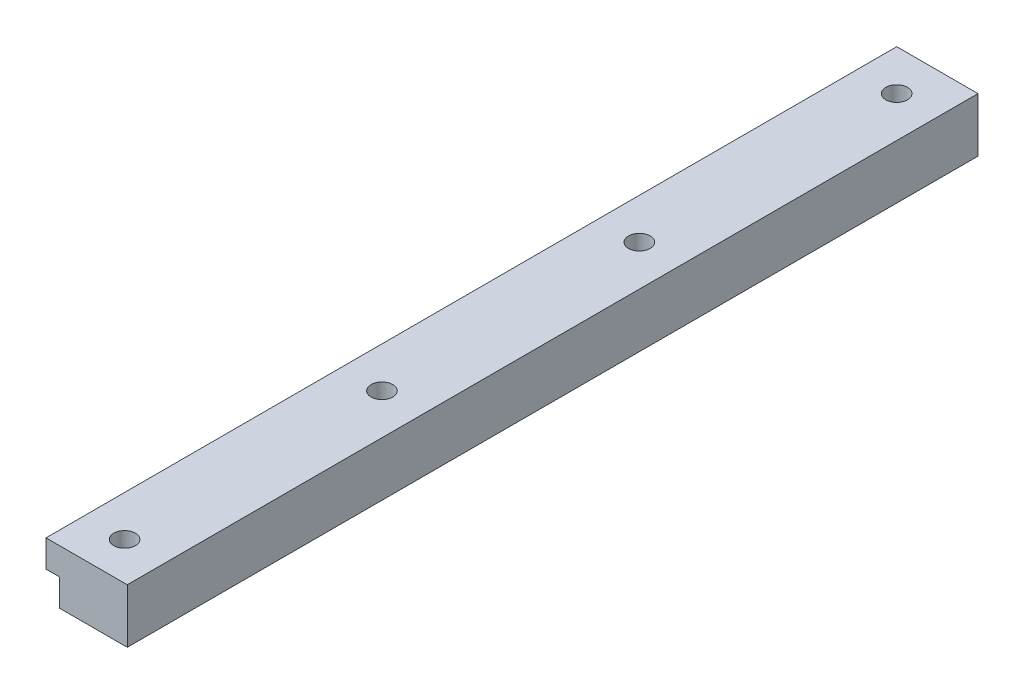
ISO-10303-21;
HEADER;
FILE_DESCRIPTION(('STEP AP214'),'2;1');
FILE_NAME('part.step','',(''),(''),'','','');
FILE_SCHEMA(('AUTOMOTIVE_DESIGN { 1 0 10303 214 1 1 1 1 }'));
ENDSEC;
DATA;
#1=APPLICATION_CONTEXT('core data for automotive mechanical design processes');
#2=APPLICATION_PROTOCOL_DEFINITION('international standard','automotive_design',2000,#1);
#3=PRODUCT_CONTEXT('',#1,'mechanical');
#4=PRODUCT('Part','Part','',(#3));
#5=PRODUCT_RELATED_PRODUCT_CATEGORY('part','',(#4));
#6=PRODUCT_DEFINITION_FORMATION('','',#4);
#7=PRODUCT_DEFINITION_CONTEXT('part definition',#1,'design');
#8=PRODUCT_DEFINITION('design','',#6,#7);
#9=PRODUCT_DEFINITION_SHAPE('','',#8);
#10=(LENGTH_UNIT() NAMED_UNIT(*) SI_UNIT(.MILLI.,.METRE.));
#11=(NAMED_UNIT(*) PLANE_ANGLE_UNIT() SI_UNIT($,.RADIAN.));
#12=(NAMED_UNIT(*) SI_UNIT($,.STERADIAN.) SOLID_ANGLE_UNIT());
#13=UNCERTAINTY_MEASURE_WITH_UNIT(LENGTH_MEASURE(1.E-05),#10,'distance_accuracy_value','');
#14=(GEOMETRIC_REPRESENTATION_CONTEXT(3) GLOBAL_UNCERTAINTY_ASSIGNED_CONTEXT((#13)) GLOBAL_UNIT_ASSIGNED_CONTEXT((#10,
#11,#12)) REPRESENTATION_CONTEXT('',''));
#15=CARTESIAN_POINT('',(0.,0.,0.));
#16=DIRECTION('',(0.,0.,1.));
#17=DIRECTION('',(1.,0.,0.));
#18=AXIS2_PLACEMENT_3D('',#15,#16,#17);
#19=CARTESIAN_POINT('',(-25.,0.,314.));
#20=DIRECTION('',(0.,1.,0.));
#21=DIRECTION('',(0.,0.,1.));
#22=AXIS2_PLACEMENT_3D('',#19,#20,#21);
#23=PLANE('',#22);
#24=CARTESIAN_POINT('',(-15.,0.,300.));
#25=DIRECTION('',(0.,1.,0.));
#26=DIRECTION('',(0.,0.,1.));
#27=AXIS2_PLACEMENT_3D('',#24,#25,#26);
#28=CIRCLE('',#27,4.);
#29=CARTESIAN_POINT('',(-15.,0.,304.));
#30=VERTEX_POINT('',#29);
#31=EDGE_CURVE('E149',#30,#30,#28,.T.);
#32=ORIENTED_EDGE('',*,*,#31,.T.);
#33=EDGE_LOOP('',(#32));
#34=FACE_BOUND('',#33,.T.);
#35=CARTESIAN_POINT('',(-15.,0.,205.));
#36=DIRECTION('',(0.,1.,0.));
#37=DIRECTION('',(0.,0.,1.));
#38=AXIS2_PLACEMENT_3D('',#35,#36,#37);
#39=CIRCLE('',#38,4.);
#40=CARTESIAN_POINT('',(-15.,0.,209.));
#41=VERTEX_POINT('',#40);
#42=EDGE_CURVE('E153',#41,#41,#39,.T.);
#43=ORIENTED_EDGE('',*,*,#42,.T.);
#44=EDGE_LOOP('',(#43));
#45=FACE_BOUND('',#44,.T.);
#46=CARTESIAN_POINT('',(-15.,0.,110.));
#47=DIRECTION('',(0.,1.,0.));
#48=DIRECTION('',(0.,0.,1.));
#49=AXIS2_PLACEMENT_3D('',#46,#47,#48);
#50=CIRCLE('',#49,4.);
#51=CARTESIAN_POINT('',(-15.,0.,114.));
#52=VERTEX_POINT('',#51);
#53=EDGE_CURVE('E157',#52,#52,#50,.T.);
#54=ORIENTED_EDGE('',*,*,#53,.T.);
#55=EDGE_LOOP('',(#54));
#56=FACE_BOUND('',#55,.T.);
#57=CARTESIAN_POINT('',(-15.,0.,15.));
#58=DIRECTION('',(0.,1.,0.));
#59=DIRECTION('',(0.,0.,1.));
#60=AXIS2_PLACEMENT_3D('',#57,#58,#59);
#61=CIRCLE('',#60,4.);
#62=CARTESIAN_POINT('',(-15.,0.,19.));
#63=VERTEX_POINT('',#62);
#64=EDGE_CURVE('E86',#63,#63,#61,.T.);
#65=ORIENTED_EDGE('',*,*,#64,.T.);
#66=EDGE_LOOP('',(#65));
#67=FACE_BOUND('',#66,.T.);
#68=DIRECTION('',(1.,0.,0.));
#69=VECTOR('',#68,1.);
#70=CARTESIAN_POINT('',(-25.,0.,0.));
#71=LINE('',#70,#69);
#72=CARTESIAN_POINT('',(-25.,0.,0.));
#73=VERTEX_POINT('',#72);
#74=CARTESIAN_POINT('',(0.,0.,0.));
#75=VERTEX_POINT('',#74);
#76=EDGE_CURVE('E72',#73,#75,#71,.T.);
#77=ORIENTED_EDGE('',*,*,#76,.T.);
#78=DIRECTION('',(0.,0.,-1.));
#79=VECTOR('',#78,1.);
#80=CARTESIAN_POINT('',(0.,0.,314.));
#81=LINE('',#80,#79);
#82=CARTESIAN_POINT('',(0.,0.,314.));
#83=VERTEX_POINT('',#82);
#84=EDGE_CURVE('E11',#83,#75,#81,.T.);
#85=ORIENTED_EDGE('',*,*,#84,.F.);
#86=DIRECTION('',(1.,0.,0.));
#87=VECTOR('',#86,1.);
#88=CARTESIAN_POINT('',(-25.,0.,314.));
#89=LINE('',#88,#87);
#90=CARTESIAN_POINT('',(-25.,0.,314.));
#91=VERTEX_POINT('',#90);
#92=EDGE_CURVE('E100',#91,#83,#89,.T.);
#93=ORIENTED_EDGE('',*,*,#92,.F.);
#94=DIRECTION('',(0.,0.,-1.));
#95=VECTOR('',#94,1.);
#96=CARTESIAN_POINT('',(-25.,0.,314.));
#97=LINE('',#96,#95);
#98=EDGE_CURVE('E85',#91,#73,#97,.T.);
#99=ORIENTED_EDGE('',*,*,#98,.T.);
#100=EDGE_LOOP('',(#77,#85,#93,#99));
#101=FACE_BOUND('',#100,.T.);
#102=ADVANCED_FACE('F16',(#34,#45,#56,#67,#101),#23,.F.);
#103=CARTESIAN_POINT('',(0.,0.,314.));
#104=DIRECTION('',(-1.,0.,0.));
#105=DIRECTION('',(0.,0.,1.));
#106=AXIS2_PLACEMENT_3D('',#103,#104,#105);
#107=PLANE('',#106);
#108=DIRECTION('',(0.,1.,0.));
#109=VECTOR('',#108,1.);
#110=CARTESIAN_POINT('',(0.,0.,0.));
#111=LINE('',#110,#109);
#112=CARTESIAN_POINT('',(0.,20.,0.));
#113=VERTEX_POINT('',#112);
#114=EDGE_CURVE('E68',#75,#113,#111,.T.);
#115=ORIENTED_EDGE('',*,*,#114,.T.);
#116=DIRECTION('',(0.,0.,-1.));
#117=VECTOR('',#116,1.);
#118=CARTESIAN_POINT('',(0.,20.,314.));
#119=LINE('',#118,#117);
#120=CARTESIAN_POINT('',(0.,20.,314.));
#121=VERTEX_POINT('',#120);
#122=EDGE_CURVE('E23',#121,#113,#119,.T.);
#123=ORIENTED_EDGE('',*,*,#122,.F.);
#124=DIRECTION('',(0.,1.,0.));
#125=VECTOR('',#124,1.);
#126=CARTESIAN_POINT('',(0.,0.,314.));
#127=LINE('',#126,#125);
#128=EDGE_CURVE('E81',#83,#121,#127,.T.);
#129=ORIENTED_EDGE('',*,*,#128,.F.);
#130=ORIENTED_EDGE('',*,*,#84,.T.);
#131=EDGE_LOOP('',(#115,#123,#129,#130));
#132=FACE_BOUND('',#131,.T.);
#133=ADVANCED_FACE('F80',(#132),#107,.F.);
#134=CARTESIAN_POINT('',(0.,20.,314.));
#135=DIRECTION('',(0.,-1.,0.));
#136=DIRECTION('',(1.,0.,0.));
#137=AXIS2_PLACEMENT_3D('',#134,#135,#136);
#138=PLANE('',#137);
#139=CARTESIAN_POINT('',(-15.,20.,300.));
#140=DIRECTION('',(0.,1.,0.));
#141=DIRECTION('',(0.,0.,1.));
#142=AXIS2_PLACEMENT_3D('',#139,#140,#141);
#143=CIRCLE('',#142,4.);
#144=CARTESIAN_POINT('',(-15.,20.,304.));
#145=VERTEX_POINT('',#144);
#146=EDGE_CURVE('E186',#145,#145,#143,.T.);
#147=ORIENTED_EDGE('',*,*,#146,.F.);
#148=EDGE_LOOP('',(#147));
#149=FACE_BOUND('',#148,.T.);
#150=CARTESIAN_POINT('',(-15.,20.,205.));
#151=DIRECTION('',(0.,1.,0.));
#152=DIRECTION('',(0.,0.,1.));
#153=AXIS2_PLACEMENT_3D('',#150,#151,#152);
#154=CIRCLE('',#153,4.);
#155=CARTESIAN_POINT('',(-15.,20.,209.));
#156=VERTEX_POINT('',#155);
#157=EDGE_CURVE('E187',#156,#156,#154,.T.);
#158=ORIENTED_EDGE('',*,*,#157,.F.);
#159=EDGE_LOOP('',(#158));
#160=FACE_BOUND('',#159,.T.);
#161=CARTESIAN_POINT('',(-15.,20.,110.));
#162=DIRECTION('',(0.,1.,0.));
#163=DIRECTION('',(0.,0.,1.));
#164=AXIS2_PLACEMENT_3D('',#161,#162,#163);
#165=CIRCLE('',#164,4.);
#166=CARTESIAN_POINT('',(-15.,20.,114.));
#167=VERTEX_POINT('',#166);
#168=EDGE_CURVE('E194',#167,#167,#165,.T.);
#169=ORIENTED_EDGE('',*,*,#168,.F.);
#170=EDGE_LOOP('',(#169));
#171=FACE_BOUND('',#170,.T.);
#172=CARTESIAN_POINT('',(-15.,20.,15.));
#173=DIRECTION('',(0.,1.,0.));
#174=DIRECTION('',(0.,0.,1.));
#175=AXIS2_PLACEMENT_3D('',#172,#173,#174);
#176=CIRCLE('',#175,4.);
#177=CARTESIAN_POINT('',(-15.,20.,19.));
#178=VERTEX_POINT('',#177);
#179=EDGE_CURVE('E89',#178,#178,#176,.T.);
#180=ORIENTED_EDGE('',*,*,#179,.F.);
#181=EDGE_LOOP('',(#180));
#182=FACE_BOUND('',#181,.T.);
#183=DIRECTION('',(-1.,0.,0.));
#184=VECTOR('',#183,1.);
#185=CARTESIAN_POINT('',(0.,20.,0.));
#186=LINE('',#185,#184);
#187=CARTESIAN_POINT('',(-30.,20.,0.));
#188=VERTEX_POINT('',#187);
#189=EDGE_CURVE('E74',#113,#188,#186,.T.);
#190=ORIENTED_EDGE('',*,*,#189,.T.);
#191=DIRECTION('',(0.,0.,-1.));
#192=VECTOR('',#191,1.);
#193=CARTESIAN_POINT('',(-30.,20.,314.));
#194=LINE('',#193,#192);
#195=CARTESIAN_POINT('',(-30.,20.,314.));
#196=VERTEX_POINT('',#195);
#197=EDGE_CURVE('E116',#196,#188,#194,.T.);
#198=ORIENTED_EDGE('',*,*,#197,.F.);
#199=DIRECTION('',(-1.,0.,0.));
#200=VECTOR('',#199,1.);
#201=CARTESIAN_POINT('',(0.,20.,314.));
#202=LINE('',#201,#200);
#203=EDGE_CURVE('E103',#121,#196,#202,.T.);
#204=ORIENTED_EDGE('',*,*,#203,.F.);
#205=ORIENTED_EDGE('',*,*,#122,.T.);
#206=EDGE_LOOP('',(#190,#198,#204,#205));
#207=FACE_BOUND('',#206,.T.);
#208=ADVANCED_FACE('F120',(#149,#160,#171,#182,#207),#138,.F.);
#209=CARTESIAN_POINT('',(-30.,20.,314.));
#210=DIRECTION('',(1.,0.,0.));
#211=DIRECTION('',(0.,1.,0.));
#212=AXIS2_PLACEMENT_3D('',#209,#210,#211);
#213=PLANE('',#212);
#214=DIRECTION('',(0.,-1.,0.));
#215=VECTOR('',#214,1.);
#216=CARTESIAN_POINT('',(-30.,20.,0.));
#217=LINE('',#216,#215);
#218=CARTESIAN_POINT('',(-30.,10.,0.));
#219=VERTEX_POINT('',#218);
#220=EDGE_CURVE('E94',#188,#219,#217,.T.);
#221=ORIENTED_EDGE('',*,*,#220,.T.);
#222=DIRECTION('',(0.,0.,-1.));
#223=VECTOR('',#222,1.);
#224=CARTESIAN_POINT('',(-30.,10.,314.));
#225=LINE('',#224,#223);
#226=CARTESIAN_POINT('',(-30.,10.,314.));
#227=VERTEX_POINT('',#226);
#228=EDGE_CURVE('E113',#227,#219,#225,.T.);
#229=ORIENTED_EDGE('',*,*,#228,.F.);
#230=DIRECTION('',(0.,-1.,0.));
#231=VECTOR('',#230,1.);
#232=CARTESIAN_POINT('',(-30.,20.,314.));
#233=LINE('',#232,#231);
#234=EDGE_CURVE('E105',#196,#227,#233,.T.);
#235=ORIENTED_EDGE('',*,*,#234,.F.);
#236=ORIENTED_EDGE('',*,*,#197,.T.);
#237=EDGE_LOOP('',(#221,#229,#235,#236));
#238=FACE_BOUND('',#237,.T.);
#239=ADVANCED_FACE('F126',(#238),#213,.F.);
#240=CARTESIAN_POINT('',(-30.,10.,314.));
#241=DIRECTION('',(0.,1.,0.));
#242=DIRECTION('',(0.,0.,1.));
#243=AXIS2_PLACEMENT_3D('',#240,#241,#242);
#244=PLANE('',#243);
#245=DIRECTION('',(1.,0.,0.));
#246=VECTOR('',#245,1.);
#247=CARTESIAN_POINT('',(-30.,10.,0.));
#248=LINE('',#247,#246);
#249=CARTESIAN_POINT('',(-25.,10.,0.));
#250=VERTEX_POINT('',#249);
#251=EDGE_CURVE('E96',#219,#250,#248,.T.);
#252=ORIENTED_EDGE('',*,*,#251,.T.);
#253=DIRECTION('',(0.,0.,-1.));
#254=VECTOR('',#253,1.);
#255=CARTESIAN_POINT('',(-25.,10.,314.));
#256=LINE('',#255,#254);
#257=CARTESIAN_POINT('',(-25.,10.,314.));
#258=VERTEX_POINT('',#257);
#259=EDGE_CURVE('E110',#258,#250,#256,.T.);
#260=ORIENTED_EDGE('',*,*,#259,.F.);
#261=DIRECTION('',(1.,0.,0.));
#262=VECTOR('',#261,1.);
#263=CARTESIAN_POINT('',(-30.,10.,314.));
#264=LINE('',#263,#262);
#265=EDGE_CURVE('E35',#227,#258,#264,.T.);
#266=ORIENTED_EDGE('',*,*,#265,.F.);
#267=ORIENTED_EDGE('',*,*,#228,.T.);
#268=EDGE_LOOP('',(#252,#260,#266,#267));
#269=FACE_BOUND('',#268,.T.);
#270=ADVANCED_FACE('F129',(#269),#244,.F.);
#271=CARTESIAN_POINT('',(-25.,10.,314.));
#272=DIRECTION('',(1.,0.,0.));
#273=DIRECTION('',(0.,0.,-1.));
#274=AXIS2_PLACEMENT_3D('',#271,#272,#273);
#275=PLANE('',#274);
#276=DIRECTION('',(0.,-1.,0.));
#277=VECTOR('',#276,1.);
#278=CARTESIAN_POINT('',(-25.,10.,0.));
#279=LINE('',#278,#277);
#280=EDGE_CURVE('E98',#250,#73,#279,.T.);
#281=ORIENTED_EDGE('',*,*,#280,.T.);
#282=ORIENTED_EDGE('',*,*,#98,.F.);
#283=DIRECTION('',(0.,-1.,0.));
#284=VECTOR('',#283,1.);
#285=CARTESIAN_POINT('',(-25.,10.,314.));
#286=LINE('',#285,#284);
#287=EDGE_CURVE('E30',#258,#91,#286,.T.);
#288=ORIENTED_EDGE('',*,*,#287,.F.);
#289=ORIENTED_EDGE('',*,*,#259,.T.);
#290=EDGE_LOOP('',(#281,#282,#288,#289));
#291=FACE_BOUND('',#290,.T.);
#292=ADVANCED_FACE('F131',(#291),#275,.F.);
#293=CARTESIAN_POINT('',(0.,0.,314.));
#294=DIRECTION('',(0.,0.,1.));
#295=DIRECTION('',(1.,0.,0.));
#296=AXIS2_PLACEMENT_3D('',#293,#294,#295);
#297=PLANE('',#296);
#298=ORIENTED_EDGE('',*,*,#92,.T.);
#299=ORIENTED_EDGE('',*,*,#128,.T.);
#300=ORIENTED_EDGE('',*,*,#203,.T.);
#301=ORIENTED_EDGE('',*,*,#234,.T.);
#302=ORIENTED_EDGE('',*,*,#265,.T.);
#303=ORIENTED_EDGE('',*,*,#287,.T.);
#304=EDGE_LOOP('',(#298,#299,#300,#301,#302,#303));
#305=FACE_BOUND('',#304,.T.);
#306=ADVANCED_FACE('F123',(#305),#297,.T.);
#307=CARTESIAN_POINT('',(0.,0.,0.));
#308=DIRECTION('',(0.,0.,1.));
#309=DIRECTION('',(1.,0.,0.));
#310=AXIS2_PLACEMENT_3D('',#307,#308,#309);
#311=PLANE('',#310);
#312=ORIENTED_EDGE('',*,*,#76,.F.);
#313=ORIENTED_EDGE('',*,*,#280,.F.);
#314=ORIENTED_EDGE('',*,*,#251,.F.);
#315=ORIENTED_EDGE('',*,*,#220,.F.);
#316=ORIENTED_EDGE('',*,*,#189,.F.);
#317=ORIENTED_EDGE('',*,*,#114,.F.);
#318=EDGE_LOOP('',(#312,#313,#314,#315,#316,#317));
#319=FACE_BOUND('',#318,.T.);
#320=ADVANCED_FACE('F69',(#319),#311,.F.);
#321=CARTESIAN_POINT('',(-15.,20.,15.));
#322=DIRECTION('',(0.,1.,0.));
#323=DIRECTION('',(0.,0.,1.));
#324=AXIS2_PLACEMENT_3D('',#321,#322,#323);
#325=CYLINDRICAL_SURFACE('',#324,4.);
#326=ORIENTED_EDGE('',*,*,#179,.T.);
#327=EDGE_LOOP('',(#326));
#328=FACE_BOUND('',#327,.T.);
#329=ORIENTED_EDGE('',*,*,#64,.F.);
#330=EDGE_LOOP('',(#329));
#331=FACE_BOUND('',#330,.T.);
#332=ADVANCED_FACE('F160',(#328,#331),#325,.F.);
#333=CARTESIAN_POINT('',(-15.,20.,110.));
#334=DIRECTION('',(0.,1.,0.));
#335=DIRECTION('',(0.,0.,1.));
#336=AXIS2_PLACEMENT_3D('',#333,#334,#335);
#337=CYLINDRICAL_SURFACE('',#336,4.);
#338=ORIENTED_EDGE('',*,*,#168,.T.);
#339=EDGE_LOOP('',(#338));
#340=FACE_BOUND('',#339,.T.);
#341=ORIENTED_EDGE('',*,*,#53,.F.);
#342=EDGE_LOOP('',(#341));
#343=FACE_BOUND('',#342,.T.);
#344=ADVANCED_FACE('F162',(#340,#343),#337,.F.);
#345=CARTESIAN_POINT('',(-15.,20.,205.));
#346=DIRECTION('',(0.,1.,0.));
#347=DIRECTION('',(0.,0.,1.));
#348=AXIS2_PLACEMENT_3D('',#345,#346,#347);
#349=CYLINDRICAL_SURFACE('',#348,4.);
#350=ORIENTED_EDGE('',*,*,#157,.T.);
#351=EDGE_LOOP('',(#350));
#352=FACE_BOUND('',#351,.T.);
#353=ORIENTED_EDGE('',*,*,#42,.F.);
#354=EDGE_LOOP('',(#353));
#355=FACE_BOUND('',#354,.T.);
#356=ADVANCED_FACE('F169',(#352,#355),#349,.F.);
#357=CARTESIAN_POINT('',(-15.,20.,300.));
#358=DIRECTION('',(0.,1.,0.));
#359=DIRECTION('',(0.,0.,1.));
#360=AXIS2_PLACEMENT_3D('',#357,#358,#359);
#361=CYLINDRICAL_SURFACE('',#360,4.);
#362=ORIENTED_EDGE('',*,*,#146,.T.);
#363=EDGE_LOOP('',(#362));
#364=FACE_BOUND('',#363,.T.);
#365=ORIENTED_EDGE('',*,*,#31,.F.);
#366=EDGE_LOOP('',(#365));
#367=FACE_BOUND('',#366,.T.);
#368=ADVANCED_FACE('F177',(#364,#367),#361,.F.);
#369=CLOSED_SHELL('',(#102,#133,#208,#239,#270,#292,#306,#320,#332,#344,#356,#368));
#370=MANIFOLD_SOLID_BREP('B1',#369);
#371=ADVANCED_BREP_SHAPE_REPRESENTATION('',(#18,#370),#14);
#372=SHAPE_DEFINITION_REPRESENTATION(#9,#371);
ENDSEC;
END-ISO-10303-21;
